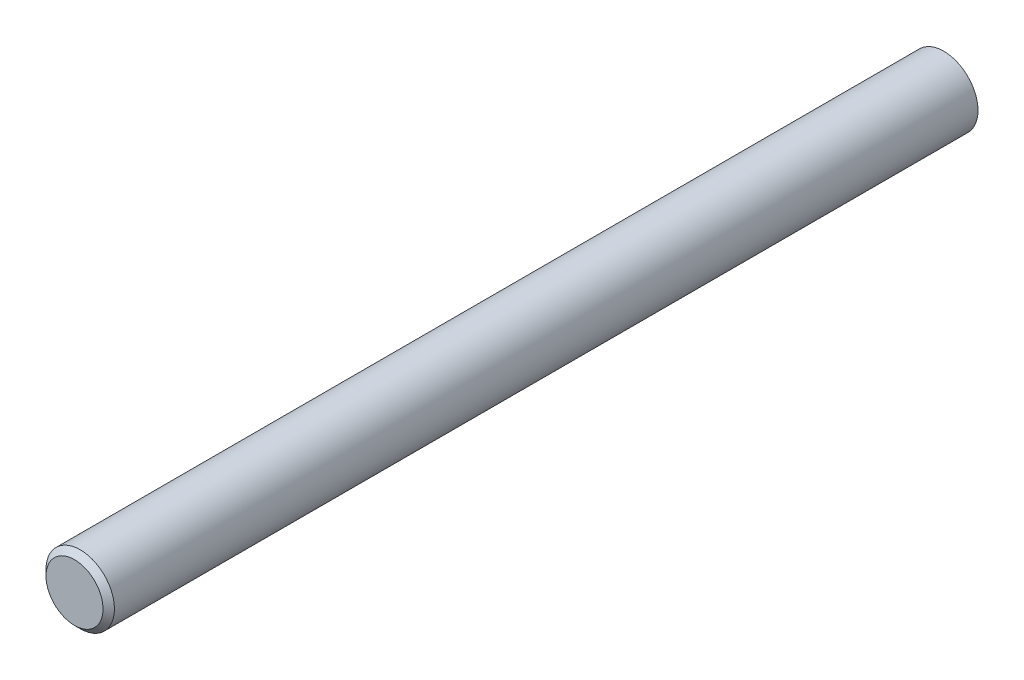
ISO-10303-21;
HEADER;
FILE_DESCRIPTION(('STEP AP214'),'2;1');
FILE_NAME('part.step','',(''),(''),'','','');
FILE_SCHEMA(('AUTOMOTIVE_DESIGN { 1 0 10303 214 1 1 1 1 }'));
ENDSEC;
DATA;
#1=APPLICATION_CONTEXT('core data for automotive mechanical design processes');
#2=APPLICATION_PROTOCOL_DEFINITION('international standard','automotive_design',2000,#1);
#3=PRODUCT_CONTEXT('',#1,'mechanical');
#4=PRODUCT('Part','Part','',(#3));
#5=PRODUCT_RELATED_PRODUCT_CATEGORY('part','',(#4));
#6=PRODUCT_DEFINITION_FORMATION('','',#4);
#7=PRODUCT_DEFINITION_CONTEXT('part definition',#1,'design');
#8=PRODUCT_DEFINITION('design','',#6,#7);
#9=PRODUCT_DEFINITION_SHAPE('','',#8);
#10=(LENGTH_UNIT() NAMED_UNIT(*) SI_UNIT(.MILLI.,.METRE.));
#11=(NAMED_UNIT(*) PLANE_ANGLE_UNIT() SI_UNIT($,.RADIAN.));
#12=(NAMED_UNIT(*) SI_UNIT($,.STERADIAN.) SOLID_ANGLE_UNIT());
#13=UNCERTAINTY_MEASURE_WITH_UNIT(LENGTH_MEASURE(1.E-05),#10,'distance_accuracy_value','');
#14=(GEOMETRIC_REPRESENTATION_CONTEXT(3) GLOBAL_UNCERTAINTY_ASSIGNED_CONTEXT((#13)) GLOBAL_UNIT_ASSIGNED_CONTEXT((#10,
#11,#12)) REPRESENTATION_CONTEXT('',''));
#15=CARTESIAN_POINT('',(0.,0.,0.));
#16=DIRECTION('',(0.,0.,1.));
#17=DIRECTION('',(1.,0.,0.));
#18=AXIS2_PLACEMENT_3D('',#15,#16,#17);
#19=CARTESIAN_POINT('',(0.,3.,-54.217520889916));
#20=DIRECTION('',(0.,0.,1.));
#21=DIRECTION('',(1.,0.,0.));
#22=AXIS2_PLACEMENT_3D('',#19,#20,#21);
#23=PLANE('',#22);
#24=CARTESIAN_POINT('',(0.,0.,-54.217520889916));
#25=DIRECTION('',(0.,0.,1.));
#26=DIRECTION('',(1.,0.,0.));
#27=AXIS2_PLACEMENT_3D('',#24,#25,#26);
#28=CIRCLE('',#27,3.);
#29=CARTESIAN_POINT('',(3.,0.,-54.217520889916));
#30=VERTEX_POINT('',#29);
#31=EDGE_CURVE('E51',#30,#30,#28,.T.);
#32=ORIENTED_EDGE('',*,*,#31,.F.);
#33=EDGE_LOOP('',(#32));
#34=FACE_BOUND('',#33,.T.);
#35=ADVANCED_FACE('F39',(#34),#23,.F.);
#36=CARTESIAN_POINT('',(0.,3.,22.));
#37=DIRECTION('',(0.,0.,-1.));
#38=DIRECTION('',(-1.,0.,0.));
#39=AXIS2_PLACEMENT_3D('',#36,#37,#38);
#40=PLANE('',#39);
#41=CARTESIAN_POINT('',(0.,0.,22.));
#42=DIRECTION('',(0.,0.,-1.));
#43=DIRECTION('',(-1.,0.,0.));
#44=AXIS2_PLACEMENT_3D('',#41,#42,#43);
#45=CIRCLE('',#44,2.49999999999999);
#46=CARTESIAN_POINT('',(-2.49999999999999,0.,22.));
#47=VERTEX_POINT('',#46);
#48=EDGE_CURVE('E47',#47,#47,#45,.F.);
#49=ORIENTED_EDGE('',*,*,#48,.T.);
#50=EDGE_LOOP('',(#49));
#51=FACE_BOUND('',#50,.T.);
#52=ADVANCED_FACE('F61',(#51),#40,.F.);
#53=CARTESIAN_POINT('',(0.,0.,22.));
#54=DIRECTION('',(0.,0.,1.));
#55=DIRECTION('',(1.,0.,0.));
#56=AXIS2_PLACEMENT_3D('',#53,#54,#55);
#57=CYLINDRICAL_SURFACE('',#56,3.);
#58=CARTESIAN_POINT('',(0.,0.,21.5));
#59=DIRECTION('',(0.,0.,-1.));
#60=DIRECTION('',(-1.,0.,0.));
#61=AXIS2_PLACEMENT_3D('',#58,#59,#60);
#62=CIRCLE('',#61,3.);
#63=CARTESIAN_POINT('',(-3.,0.,21.5));
#64=VERTEX_POINT('',#63);
#65=EDGE_CURVE('E10',#64,#64,#62,.T.);
#66=ORIENTED_EDGE('',*,*,#65,.T.);
#67=EDGE_LOOP('',(#66));
#68=FACE_BOUND('',#67,.T.);
#69=ORIENTED_EDGE('',*,*,#31,.T.);
#70=EDGE_LOOP('',(#69));
#71=FACE_BOUND('',#70,.T.);
#72=ADVANCED_FACE('F58',(#68,#71),#57,.T.);
#73=CARTESIAN_POINT('',(0.,0.,22.));
#74=DIRECTION('',(0.,0.,-1.));
#75=DIRECTION('',(-1.,0.,0.));
#76=AXIS2_PLACEMENT_3D('',#73,#74,#75);
#77=CONICAL_SURFACE('',#76,2.49999999999999,0.785398163397453);
#78=ORIENTED_EDGE('',*,*,#65,.F.);
#79=EDGE_LOOP('',(#78));
#80=FACE_BOUND('',#79,.T.);
#81=ORIENTED_EDGE('',*,*,#48,.F.);
#82=EDGE_LOOP('',(#81));
#83=FACE_BOUND('',#82,.T.);
#84=ADVANCED_FACE('F42',(#80,#83),#77,.T.);
#85=CLOSED_SHELL('',(#35,#52,#72,#84));
#86=MANIFOLD_SOLID_BREP('B2',#85);
#87=ADVANCED_BREP_SHAPE_REPRESENTATION('',(#18,#86),#14);
#88=SHAPE_DEFINITION_REPRESENTATION(#9,#87);
ENDSEC;
END-ISO-10303-21;
